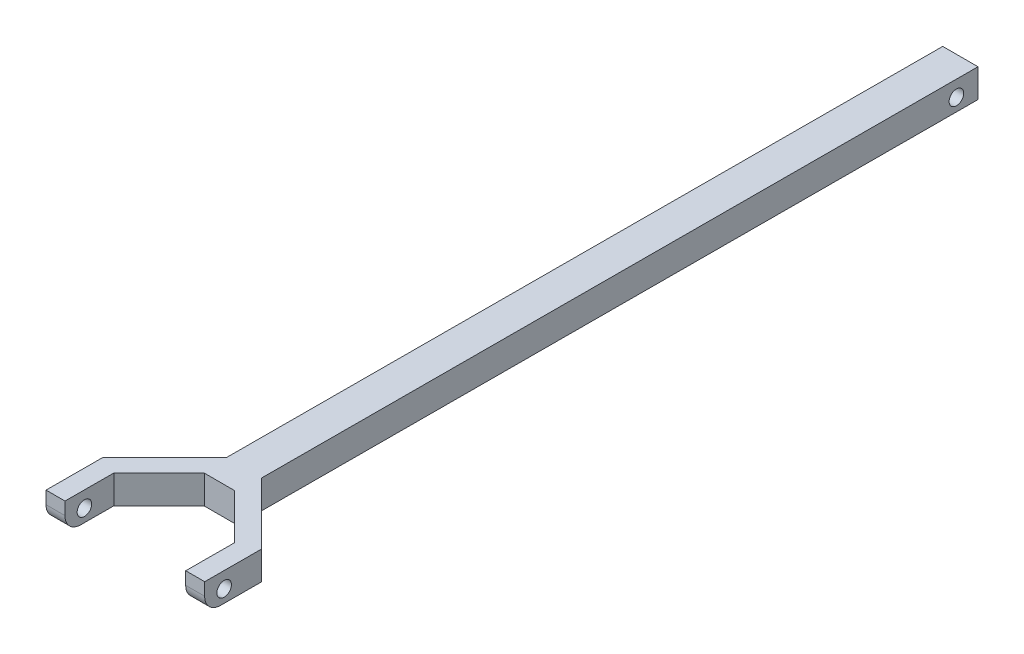
ISO-10303-21;
HEADER;
FILE_DESCRIPTION(('STEP AP214'),'2;1');
FILE_NAME('part.step','',(''),(''),'','','');
FILE_SCHEMA(('AUTOMOTIVE_DESIGN { 1 0 10303 214 1 1 1 1 }'));
ENDSEC;
DATA;
#1=APPLICATION_CONTEXT('core data for automotive mechanical design processes');
#2=APPLICATION_PROTOCOL_DEFINITION('international standard','automotive_design',2000,#1);
#3=PRODUCT_CONTEXT('',#1,'mechanical');
#4=PRODUCT('Part','Part','',(#3));
#5=PRODUCT_RELATED_PRODUCT_CATEGORY('part','',(#4));
#6=PRODUCT_DEFINITION_FORMATION('','',#4);
#7=PRODUCT_DEFINITION_CONTEXT('part definition',#1,'design');
#8=PRODUCT_DEFINITION('design','',#6,#7);
#9=PRODUCT_DEFINITION_SHAPE('','',#8);
#10=(LENGTH_UNIT() NAMED_UNIT(*) SI_UNIT(.MILLI.,.METRE.));
#11=(NAMED_UNIT(*) PLANE_ANGLE_UNIT() SI_UNIT($,.RADIAN.));
#12=(NAMED_UNIT(*) SI_UNIT($,.STERADIAN.) SOLID_ANGLE_UNIT());
#13=UNCERTAINTY_MEASURE_WITH_UNIT(LENGTH_MEASURE(1.E-05),#10,'distance_accuracy_value','');
#14=(GEOMETRIC_REPRESENTATION_CONTEXT(3) GLOBAL_UNCERTAINTY_ASSIGNED_CONTEXT((#13)) GLOBAL_UNIT_ASSIGNED_CONTEXT((#10,
#11,#12)) REPRESENTATION_CONTEXT('',''));
#15=CARTESIAN_POINT('',(0.,0.,0.));
#16=DIRECTION('',(0.,0.,1.));
#17=DIRECTION('',(1.,0.,0.));
#18=AXIS2_PLACEMENT_3D('',#15,#16,#17);
#19=CARTESIAN_POINT('',(3.33984376650697,11.540663664861,-74.8869134229491));
#20=DIRECTION('',(0.,0.999995866704138,-0.00287516515017934));
#21=DIRECTION('',(0.,-0.00287516515017934,-0.999995866704138));
#22=AXIS2_PLACEMENT_3D('',#19,#20,#21);
#23=PLANE('',#22);
#24=DIRECTION('',(0.,0.00287516515017934,0.999995866704138));
#25=VECTOR('',#24,1.);
#26=CARTESIAN_POINT('',(0.550981021856869,11.6019466932159,-53.5723899597585));
#27=LINE('',#26,#25);
#28=CARTESIAN_POINT('',(0.550981021856869,11.4629001913203,-101.933412688022));
#29=VERTEX_POINT('',#28);
#30=CARTESIAN_POINT('',(0.550981021856862,11.7888324279776,11.4273413760104));
#31=VERTEX_POINT('',#30);
#32=EDGE_CURVE('E408',#29,#31,#27,.T.);
#33=ORIENTED_EDGE('',*,*,#32,.T.);
#34=DIRECTION('',(-0.707106781186547,0.00203304877472305,0.707103858505015));
#35=VECTOR('',#34,1.);
#36=CARTESIAN_POINT('',(0.550981021856862,11.7888324279776,11.4273413760104));
#37=LINE('',#36,#35);
#38=CARTESIAN_POINT('',(-9.21015623349303,11.8168973096403,21.1884382856921));
#39=VERTEX_POINT('',#38);
#40=EDGE_CURVE('E389',#31,#39,#37,.T.);
#41=ORIENTED_EDGE('',*,*,#40,.T.);
#42=DIRECTION('',(0.,0.00287516515017934,0.999995866704138));
#43=VECTOR('',#42,1.);
#44=CARTESIAN_POINT('',(-9.21015623349303,11.8426900201157,30.1592634450462));
#45=LINE('',#44,#43);
#46=CARTESIAN_POINT('',(-9.21015623349303,11.8426900201157,30.1592634450462));
#47=VERTEX_POINT('',#46);
#48=EDGE_CURVE('E386',#39,#47,#45,.T.);
#49=ORIENTED_EDGE('',*,*,#48,.T.);
#50=DIRECTION('',(1.,0.,0.));
#51=VECTOR('',#50,1.);
#52=CARTESIAN_POINT('',(3.33984376650696,11.8426900201157,30.1592634450462));
#53=LINE('',#52,#51);
#54=CARTESIAN_POINT('',(-6.21015623349303,11.8426900201157,30.1592634450462));
#55=VERTEX_POINT('',#54);
#56=EDGE_CURVE('E381',#47,#55,#53,.T.);
#57=ORIENTED_EDGE('',*,*,#56,.T.);
#58=DIRECTION('',(0.,-0.00287516515017934,-0.999995866704138));
#59=VECTOR('',#58,1.);
#60=CARTESIAN_POINT('',(-6.21015623349303,11.8426900201157,30.1592634450462));
#61=LINE('',#60,#59);
#62=CARTESIAN_POINT('',(-6.21015623349303,11.8204701068381,22.4310738366098));
#63=VERTEX_POINT('',#62);
#64=EDGE_CURVE('E376',#55,#63,#61,.T.);
#65=ORIENTED_EDGE('',*,*,#64,.T.);
#66=DIRECTION('',(0.707106781186548,-0.00203304877472305,-0.707103858505014));
#67=VECTOR('',#66,1.);
#68=CARTESIAN_POINT('',(-6.21015623349303,11.8204701068381,22.4310738366098));
#69=LINE('',#68,#67);
#70=CARTESIAN_POINT('',(0.950733326051764,11.7998813667322,15.2702138751402));
#71=VERTEX_POINT('',#70);
#72=EDGE_CURVE('E371',#63,#71,#69,.T.);
#73=ORIENTED_EDGE('',*,*,#72,.T.);
#74=DIRECTION('',(1.,0.,0.));
#75=VECTOR('',#74,1.);
#76=CARTESIAN_POINT('',(5.72895420696216,11.7998813667322,15.2702138751402));
#77=LINE('',#76,#75);
#78=CARTESIAN_POINT('',(5.72895420696216,11.7998813667322,15.2702138751402));
#79=VERTEX_POINT('',#78);
#80=EDGE_CURVE('E366',#71,#79,#77,.T.);
#81=ORIENTED_EDGE('',*,*,#80,.T.);
#82=DIRECTION('',(0.707106781186548,0.00203304877472305,0.707103858505014));
#83=VECTOR('',#82,1.);
#84=CARTESIAN_POINT('',(12.889843766507,11.8204701068381,22.4310738366098));
#85=LINE('',#84,#83);
#86=CARTESIAN_POINT('',(12.889843766507,11.8204701068381,22.4310738366098));
#87=VERTEX_POINT('',#86);
#88=EDGE_CURVE('E361',#79,#87,#85,.T.);
#89=ORIENTED_EDGE('',*,*,#88,.T.);
#90=DIRECTION('',(0.,0.00287516515017934,0.999995866704138));
#91=VECTOR('',#90,1.);
#92=CARTESIAN_POINT('',(12.889843766507,11.8426900201157,30.1592634450462));
#93=LINE('',#92,#91);
#94=CARTESIAN_POINT('',(12.889843766507,11.8426900201157,30.1592634450462));
#95=VERTEX_POINT('',#94);
#96=EDGE_CURVE('E356',#87,#95,#93,.T.);
#97=ORIENTED_EDGE('',*,*,#96,.T.);
#98=DIRECTION('',(1.,0.,0.));
#99=VECTOR('',#98,1.);
#100=CARTESIAN_POINT('',(15.889843766507,11.8426900201157,30.1592634450462));
#101=LINE('',#100,#99);
#102=CARTESIAN_POINT('',(15.889843766507,11.8426900201157,30.1592634450462));
#103=VERTEX_POINT('',#102);
#104=EDGE_CURVE('E351',#95,#103,#101,.T.);
#105=ORIENTED_EDGE('',*,*,#104,.T.);
#106=DIRECTION('',(0.,-0.00287516515017934,-0.999995866704138));
#107=VECTOR('',#106,1.);
#108=CARTESIAN_POINT('',(15.889843766507,11.8426900201157,30.1592634450462));
#109=LINE('',#108,#107);
#110=CARTESIAN_POINT('',(15.889843766507,11.8168973096403,21.1884382856921));
#111=VERTEX_POINT('',#110);
#112=EDGE_CURVE('E346',#103,#111,#109,.T.);
#113=ORIENTED_EDGE('',*,*,#112,.T.);
#114=DIRECTION('',(-0.707106781186547,-0.00203304877472305,-0.707103858505015));
#115=VECTOR('',#114,1.);
#116=CARTESIAN_POINT('',(6.12870651115707,11.7888324279776,11.4273413760104));
#117=LINE('',#116,#115);
#118=CARTESIAN_POINT('',(6.12870651115707,11.7888324279776,11.4273413760104));
#119=VERTEX_POINT('',#118);
#120=EDGE_CURVE('E340',#111,#119,#117,.T.);
#121=ORIENTED_EDGE('',*,*,#120,.T.);
#122=DIRECTION('',(0.,-0.00287516515017934,-0.999995866704138));
#123=VECTOR('',#122,1.);
#124=CARTESIAN_POINT('',(6.12870651115697,11.4255230443679,-114.933358955176));
#125=LINE('',#124,#123);
#126=CARTESIAN_POINT('',(6.12870651115697,11.4629001913203,-101.933412688022));
#127=VERTEX_POINT('',#126);
#128=EDGE_CURVE('E394',#119,#127,#125,.T.);
#129=ORIENTED_EDGE('',*,*,#128,.T.);
#130=DIRECTION('',(1.,0.,0.));
#131=VECTOR('',#130,1.);
#132=CARTESIAN_POINT('',(4.73427513883197,11.4629001913203,-101.933412688022));
#133=LINE('',#132,#131);
#134=EDGE_CURVE('E399',#29,#127,#133,.T.);
#135=ORIENTED_EDGE('',*,*,#134,.F.);
#136=EDGE_LOOP('',(#33,#41,#49,#57,#65,#73,#81,#89,#97,#105,#113,#121,#129,#135));
#137=FACE_BOUND('',#136,.T.);
#138=ADVANCED_FACE('F44',(#137),#23,.T.);
#139=CARTESIAN_POINT('',(-6.21015623349303,8.97270726770621,-98.5188717565437));
#140=DIRECTION('',(1.,0.,0.));
#141=DIRECTION('',(0.,-0.00287516515017934,-0.999995866704138));
#142=AXIS2_PLACEMENT_3D('',#139,#140,#141);
#143=CYLINDRICAL_SURFACE('',#142,1.15);
#144=CARTESIAN_POINT('',(6.12870651115707,8.97270726770621,-98.5188717565437));
#145=DIRECTION('',(-1.,0.,0.));
#146=DIRECTION('',(0.,-0.00287516515017934,-0.999995866704138));
#147=AXIS2_PLACEMENT_3D('',#144,#145,#146);
#148=CIRCLE('',#147,1.15);
#149=CARTESIAN_POINT('',(6.12870651115707,8.96940082778351,-99.6688670032535));
#150=VERTEX_POINT('',#149);
#151=EDGE_CURVE('E412',#150,#150,#148,.T.);
#152=ORIENTED_EDGE('',*,*,#151,.F.);
#153=EDGE_LOOP('',(#152));
#154=FACE_BOUND('',#153,.T.);
#155=CARTESIAN_POINT('',(0.550981021856869,8.97270726770621,-98.5188717565437));
#156=DIRECTION('',(1.,0.,0.));
#157=DIRECTION('',(0.,-0.00287516515017934,-0.999995866704138));
#158=AXIS2_PLACEMENT_3D('',#155,#156,#157);
#159=CIRCLE('',#158,1.15);
#160=CARTESIAN_POINT('',(0.550981021856869,8.96940082778351,-99.6688670032535));
#161=VERTEX_POINT('',#160);
#162=EDGE_CURVE('E54',#161,#161,#159,.T.);
#163=ORIENTED_EDGE('',*,*,#162,.F.);
#164=EDGE_LOOP('',(#163));
#165=FACE_BOUND('',#164,.T.);
#166=ADVANCED_FACE('F439',(#154,#165),#143,.F.);
#167=CARTESIAN_POINT('',(6.12870651115697,8.96291052455993,-101.926224775146));
#168=DIRECTION('',(0.,-0.00287516515017934,-0.999995866704138));
#169=DIRECTION('',(-1.,0.,0.));
#170=AXIS2_PLACEMENT_3D('',#167,#168,#169);
#171=PLANE('',#170);
#172=DIRECTION('',(0.,0.999995866704138,-0.00287516515017934));
#173=VECTOR('',#172,1.);
#174=CARTESIAN_POINT('',(0.550981021856869,8.96291052455993,-101.926224775146));
#175=LINE('',#174,#173);
#176=CARTESIAN_POINT('',(0.550981021856869,6.96291879115166,-101.920474444846));
#177=VERTEX_POINT('',#176);
#178=EDGE_CURVE('E423',#177,#29,#175,.T.);
#179=ORIENTED_EDGE('',*,*,#178,.T.);
#180=ORIENTED_EDGE('',*,*,#134,.T.);
#181=DIRECTION('',(0.,-0.999995866704138,0.00287516515017934));
#182=VECTOR('',#181,1.);
#183=CARTESIAN_POINT('',(6.12870651115697,8.96291052455993,-101.926224775146));
#184=LINE('',#183,#182);
#185=CARTESIAN_POINT('',(6.12870651115697,6.96291879115166,-101.920474444846));
#186=VERTEX_POINT('',#185);
#187=EDGE_CURVE('E416',#127,#186,#184,.T.);
#188=ORIENTED_EDGE('',*,*,#187,.T.);
#189=DIRECTION('',(1.,0.,0.));
#190=VECTOR('',#189,1.);
#191=CARTESIAN_POINT('',(4.73427513883197,6.96291879115166,-101.920474444846));
#192=LINE('',#191,#190);
#193=EDGE_CURVE('E429',#177,#186,#192,.T.);
#194=ORIENTED_EDGE('',*,*,#193,.F.);
#195=EDGE_LOOP('',(#179,#180,#188,#194));
#196=FACE_BOUND('',#195,.T.);
#197=ADVANCED_FACE('F441',(#196),#171,.T.);
#198=CARTESIAN_POINT('',(0.550981021856869,8.9255333776076,-114.9261710423));
#199=DIRECTION('',(-1.,0.,0.));
#200=DIRECTION('',(0.,0.00287516515017934,0.999995866704138));
#201=AXIS2_PLACEMENT_3D('',#198,#199,#200);
#202=PLANE('',#201);
#203=ORIENTED_EDGE('',*,*,#162,.T.);
#204=EDGE_LOOP('',(#203));
#205=FACE_BOUND('',#204,.T.);
#206=DIRECTION('',(0.,-0.00287516515017934,-0.999995866704138));
#207=VECTOR('',#206,1.);
#208=CARTESIAN_POINT('',(0.550981021856869,6.98311195444586,-94.8971979458865));
#209=LINE('',#208,#207);
#210=CARTESIAN_POINT('',(0.550981021856862,7.28885102780899,11.4402796191862));
#211=VERTEX_POINT('',#210);
#212=EDGE_CURVE('E11',#211,#177,#209,.T.);
#213=ORIENTED_EDGE('',*,*,#212,.F.);
#214=DIRECTION('',(0.,-0.999995866704138,0.00287516515017934));
#215=VECTOR('',#214,1.);
#216=CARTESIAN_POINT('',(0.550981021856862,9.28884276121727,11.4345292888859));
#217=LINE('',#216,#215);
#218=EDGE_CURVE('E328',#31,#211,#217,.T.);
#219=ORIENTED_EDGE('',*,*,#218,.F.);
#220=ORIENTED_EDGE('',*,*,#32,.F.);
#221=ORIENTED_EDGE('',*,*,#178,.F.);
#222=EDGE_LOOP('',(#213,#219,#220,#221));
#223=FACE_BOUND('',#222,.T.);
#224=ADVANCED_FACE('F436',(#205,#223),#202,.T.);
#225=CARTESIAN_POINT('',(6.12870651115707,9.1019570264556,-53.5652020468831));
#226=DIRECTION('',(1.,0.,0.));
#227=DIRECTION('',(0.,-0.00287516515017934,-0.999995866704138));
#228=AXIS2_PLACEMENT_3D('',#225,#226,#227);
#229=PLANE('',#228);
#230=ORIENTED_EDGE('',*,*,#151,.T.);
#231=EDGE_LOOP('',(#230));
#232=FACE_BOUND('',#231,.T.);
#233=ORIENTED_EDGE('',*,*,#128,.F.);
#234=DIRECTION('',(0.,0.999995866704138,-0.00287516515017934));
#235=VECTOR('',#234,1.);
#236=CARTESIAN_POINT('',(6.12870651115707,9.28884276121727,11.4345292888859));
#237=LINE('',#236,#235);
#238=CARTESIAN_POINT('',(6.12870651115707,7.28885102780899,11.4402796191862));
#239=VERTEX_POINT('',#238);
#240=EDGE_CURVE('E221',#239,#119,#237,.T.);
#241=ORIENTED_EDGE('',*,*,#240,.F.);
#242=DIRECTION('',(0.,0.00287516515017934,0.999995866704138));
#243=VECTOR('',#242,1.);
#244=CARTESIAN_POINT('',(6.12870651115707,7.07132377886985,-64.2167134481781));
#245=LINE('',#244,#243);
#246=EDGE_CURVE('E68',#186,#239,#245,.T.);
#247=ORIENTED_EDGE('',*,*,#246,.F.);
#248=ORIENTED_EDGE('',*,*,#187,.F.);
#249=EDGE_LOOP('',(#233,#241,#247,#248));
#250=FACE_BOUND('',#249,.T.);
#251=ADVANCED_FACE('F455',(#232,#250),#229,.T.);
#252=CARTESIAN_POINT('',(3.33984376650697,7.04068226469239,-74.8739751797733));
#253=DIRECTION('',(0.,-0.999995866704138,0.00287516515017934));
#254=DIRECTION('',(0.,0.00287516515017934,0.999995866704138));
#255=AXIS2_PLACEMENT_3D('',#252,#253,#254);
#256=PLANE('',#255);
#257=ORIENTED_EDGE('',*,*,#246,.T.);
#258=DIRECTION('',(0.707106781186547,0.00203304877472305,0.707103858505015));
#259=VECTOR('',#258,1.);
#260=CARTESIAN_POINT('',(4.98340656197287,7.28555810130859,10.2949844038656));
#261=LINE('',#260,#259);
#262=CARTESIAN_POINT('',(15.889843766507,7.31691590947169,21.2013765288679));
#263=VERTEX_POINT('',#262);
#264=EDGE_CURVE('E167',#239,#263,#261,.T.);
#265=ORIENTED_EDGE('',*,*,#264,.T.);
#266=DIRECTION('',(0.,0.00287516515017934,0.999995866704138));
#267=VECTOR('',#266,1.);
#268=CARTESIAN_POINT('',(15.889843766507,7.28513830970059,10.1489789221088));
#269=LINE('',#268,#267);
#270=CARTESIAN_POINT('',(15.889843766507,7.33552070707167,27.6722120214617));
#271=VERTEX_POINT('',#270);
#272=EDGE_CURVE('E160',#263,#271,#269,.T.);
#273=ORIENTED_EDGE('',*,*,#272,.T.);
#274=DIRECTION('',(1.,0.,0.));
#275=VECTOR('',#274,1.);
#276=CARTESIAN_POINT('',(8.11484376650696,7.33552070707167,27.6722120214617));
#277=LINE('',#276,#275);
#278=CARTESIAN_POINT('',(12.889843766507,7.33552070707167,27.6722120214617));
#279=VERTEX_POINT('',#278);
#280=EDGE_CURVE('E164',#279,#271,#277,.T.);
#281=ORIENTED_EDGE('',*,*,#280,.F.);
#282=DIRECTION('',(0.,-0.00287516515017934,-0.999995866704138));
#283=VECTOR('',#282,1.);
#284=CARTESIAN_POINT('',(12.889843766507,7.27402835306177,6.28488411789061));
#285=LINE('',#284,#283);
#286=CARTESIAN_POINT('',(12.889843766507,7.32048870666949,22.4440120797856));
#287=VERTEX_POINT('',#286);
#288=EDGE_CURVE('E236',#279,#287,#285,.T.);
#289=ORIENTED_EDGE('',*,*,#288,.T.);
#290=DIRECTION('',(-0.707106781186548,-0.00203304877472305,-0.707103858505014));
#291=VECTOR('',#290,1.);
#292=CARTESIAN_POINT('',(-1.15769838957933,7.28009970301663,8.39652798634716));
#293=LINE('',#292,#291);
#294=CARTESIAN_POINT('',(5.72895420696216,7.2998999665636,15.283152118316));
#295=VERTEX_POINT('',#294);
#296=EDGE_CURVE('E257',#287,#295,#293,.T.);
#297=ORIENTED_EDGE('',*,*,#296,.T.);
#298=DIRECTION('',(-1.,0.,0.));
#299=VECTOR('',#298,1.);
#300=CARTESIAN_POINT('',(2.14528854627936,7.2998999665636,15.283152118316));
#301=LINE('',#300,#299);
#302=CARTESIAN_POINT('',(0.950733326051764,7.2998999665636,15.283152118316));
#303=VERTEX_POINT('',#302);
#304=EDGE_CURVE('E267',#295,#303,#301,.T.);
#305=ORIENTED_EDGE('',*,*,#304,.T.);
#306=DIRECTION('',(-0.707106781186548,0.00203304877472305,0.707103858505014));
#307=VECTOR('',#306,1.);
#308=CARTESIAN_POINT('',(4.25694114282087,7.29039407306958,11.976957967082));
#309=LINE('',#308,#307);
#310=CARTESIAN_POINT('',(-6.21015623349303,7.32048870666949,22.4440120797856));
#311=VERTEX_POINT('',#310);
#312=EDGE_CURVE('E279',#303,#311,#309,.T.);
#313=ORIENTED_EDGE('',*,*,#312,.T.);
#314=DIRECTION('',(0.,0.00287516515017934,0.999995866704138));
#315=VECTOR('',#314,1.);
#316=CARTESIAN_POINT('',(-6.21015623349303,7.28513830970059,10.1489789221088));
#317=LINE('',#316,#315);
#318=CARTESIAN_POINT('',(-6.21015623349303,7.33552070707167,27.6722120214617));
#319=VERTEX_POINT('',#318);
#320=EDGE_CURVE('E190',#311,#319,#317,.T.);
#321=ORIENTED_EDGE('',*,*,#320,.T.);
#322=DIRECTION('',(1.,0.,0.));
#323=VECTOR('',#322,1.);
#324=CARTESIAN_POINT('',(8.11484376650696,7.33552070707167,27.6722120214617));
#325=LINE('',#324,#323);
#326=CARTESIAN_POINT('',(-9.21015623349303,7.33552070707167,27.6722120214617));
#327=VERTEX_POINT('',#326);
#328=EDGE_CURVE('E186',#327,#319,#325,.T.);
#329=ORIENTED_EDGE('',*,*,#328,.F.);
#330=DIRECTION('',(0.,-0.00287516515017934,-0.999995866704138));
#331=VECTOR('',#330,1.);
#332=CARTESIAN_POINT('',(-9.21015623349303,7.27224195446287,5.66356634243181));
#333=LINE('',#332,#331);
#334=CARTESIAN_POINT('',(-9.21015623349303,7.31691590947169,21.2013765288679));
#335=VERTEX_POINT('',#334);
#336=EDGE_CURVE('E307',#327,#335,#333,.T.);
#337=ORIENTED_EDGE('',*,*,#336,.T.);
#338=DIRECTION('',(0.707106781186547,-0.00203304877472305,-0.707103858505015));
#339=VECTOR('',#338,1.);
#340=CARTESIAN_POINT('',(6.57684959871596,7.27152566047724,5.41443594902476));
#341=LINE('',#340,#339);
#342=EDGE_CURVE('E325',#335,#211,#341,.T.);
#343=ORIENTED_EDGE('',*,*,#342,.T.);
#344=ORIENTED_EDGE('',*,*,#212,.T.);
#345=ORIENTED_EDGE('',*,*,#193,.T.);
#346=EDGE_LOOP('',(#257,#265,#273,#281,#289,#297,#305,#313,#321,#329,#337,#343,#344,#345));
#347=FACE_BOUND('',#346,.T.);
#348=ADVANCED_FACE('F46',(#347),#256,.T.);
#349=CARTESIAN_POINT('',(0.550981021856862,9.28884276121727,11.4345292888859));
#350=DIRECTION('',(-0.707106781186548,-0.00203304877472305,-0.707103858505014));
#351=DIRECTION('',(-0.707106781186547,0.00203304877472305,0.707103858505015));
#352=AXIS2_PLACEMENT_3D('',#349,#350,#351);
#353=PLANE('',#352);
#354=DIRECTION('',(0.,0.999995866704138,-0.00287516515017934));
#355=VECTOR('',#354,1.);
#356=CARTESIAN_POINT('',(-9.21015623349303,9.31690764287996,21.1956261985676));
#357=LINE('',#356,#355);
#358=EDGE_CURVE('E334',#335,#39,#357,.T.);
#359=ORIENTED_EDGE('',*,*,#358,.T.);
#360=ORIENTED_EDGE('',*,*,#40,.F.);
#361=ORIENTED_EDGE('',*,*,#218,.T.);
#362=ORIENTED_EDGE('',*,*,#342,.F.);
#363=EDGE_LOOP('',(#359,#360,#361,#362));
#364=FACE_BOUND('',#363,.T.);
#365=ADVANCED_FACE('F472',(#364),#353,.T.);
#366=CARTESIAN_POINT('',(-9.21015623349303,9.31690764287996,21.1956261985676));
#367=DIRECTION('',(-1.,0.,0.));
#368=DIRECTION('',(0.,0.00287516515017934,0.999995866704138));
#369=AXIS2_PLACEMENT_3D('',#366,#367,#368);
#370=PLANE('',#369);
#371=CARTESIAN_POINT('',(-9.21015623349303,9.33383960989393,27.0846434009645));
#372=DIRECTION('',(1.,0.,0.));
#373=DIRECTION('',(0.,-0.00287516515017934,-0.999995866704138));
#374=AXIS2_PLACEMENT_3D('',#371,#372,#373);
#375=CIRCLE('',#374,1.15);
#376=CARTESIAN_POINT('',(-9.21015623349303,9.33053316997122,25.9346481542547));
#377=VERTEX_POINT('',#376);
#378=EDGE_CURVE('E321',#377,#377,#375,.T.);
#379=ORIENTED_EDGE('',*,*,#378,.T.);
#380=EDGE_LOOP('',(#379));
#381=FACE_BOUND('',#380,.T.);
#382=CARTESIAN_POINT('',(-9.21015623349303,9.83551037383202,27.6650241085863));
#383=DIRECTION('',(1.,0.,0.));
#384=DIRECTION('',(0.,0.00287516515017934,0.999995866704138));
#385=AXIS2_PLACEMENT_3D('',#382,#383,#384);
#386=CIRCLE('',#385,2.5);
#387=CARTESIAN_POINT('',(-9.21015623349303,9.84269828670746,30.1650137753466));
#388=VERTEX_POINT('',#387);
#389=EDGE_CURVE('E317',#388,#327,#386,.T.);
#390=ORIENTED_EDGE('',*,*,#389,.F.);
#391=DIRECTION('',(0.,0.999995866704138,-0.00287516515017934));
#392=VECTOR('',#391,1.);
#393=CARTESIAN_POINT('',(-9.21015623349303,9.34270035335539,30.1664513579217));
#394=LINE('',#393,#392);
#395=EDGE_CURVE('E311',#388,#47,#394,.T.);
#396=ORIENTED_EDGE('',*,*,#395,.T.);
#397=ORIENTED_EDGE('',*,*,#48,.F.);
#398=ORIENTED_EDGE('',*,*,#358,.F.);
#399=ORIENTED_EDGE('',*,*,#336,.F.);
#400=EDGE_LOOP('',(#390,#396,#397,#398,#399));
#401=FACE_BOUND('',#400,.T.);
#402=ADVANCED_FACE('F477',(#381,#401),#370,.T.);
#403=CARTESIAN_POINT('',(12.889843766507,9.34270035335539,30.1664513579217));
#404=DIRECTION('',(0.,0.00287516515017934,0.999995866704138));
#405=DIRECTION('',(1.,0.,0.));
#406=AXIS2_PLACEMENT_3D('',#403,#404,#405);
#407=PLANE('',#406);
#408=DIRECTION('',(-1.,0.,0.));
#409=VECTOR('',#408,1.);
#410=CARTESIAN_POINT('',(8.11484376650696,9.84269828670746,30.1650137753466));
#411=LINE('',#410,#409);
#412=CARTESIAN_POINT('',(-6.21015623349303,9.84269828670746,30.1650137753466));
#413=VERTEX_POINT('',#412);
#414=EDGE_CURVE('E303',#413,#388,#411,.T.);
#415=ORIENTED_EDGE('',*,*,#414,.F.);
#416=DIRECTION('',(0.,0.999995866704138,-0.00287516515017934));
#417=VECTOR('',#416,1.);
#418=CARTESIAN_POINT('',(-6.21015623349303,9.34270035335539,30.1664513579217));
#419=LINE('',#418,#417);
#420=EDGE_CURVE('E297',#413,#55,#419,.T.);
#421=ORIENTED_EDGE('',*,*,#420,.T.);
#422=ORIENTED_EDGE('',*,*,#56,.F.);
#423=ORIENTED_EDGE('',*,*,#395,.F.);
#424=EDGE_LOOP('',(#415,#421,#422,#423));
#425=FACE_BOUND('',#424,.T.);
#426=ADVANCED_FACE('F483',(#425),#407,.T.);
#427=CARTESIAN_POINT('',(-6.21015623349303,9.32048044007776,22.4382617494852));
#428=DIRECTION('',(0.707106781186547,0.00203304877472305,0.707103858505015));
#429=DIRECTION('',(0.707106781186548,-0.00203304877472305,-0.707103858505014));
#430=AXIS2_PLACEMENT_3D('',#427,#428,#429);
#431=PLANE('',#430);
#432=DIRECTION('',(0.,0.999995866704138,-0.00287516515017934));
#433=VECTOR('',#432,1.);
#434=CARTESIAN_POINT('',(0.950733326051764,9.29989169997188,15.2774017880156));
#435=LINE('',#434,#433);
#436=EDGE_CURVE('E291',#303,#71,#435,.T.);
#437=ORIENTED_EDGE('',*,*,#436,.T.);
#438=ORIENTED_EDGE('',*,*,#72,.F.);
#439=DIRECTION('',(0.,0.999995866704138,-0.00287516515017934));
#440=VECTOR('',#439,1.);
#441=CARTESIAN_POINT('',(-6.21015623349303,9.32048044007776,22.4382617494852));
#442=LINE('',#441,#440);
#443=EDGE_CURVE('E285',#311,#63,#442,.T.);
#444=ORIENTED_EDGE('',*,*,#443,.F.);
#445=ORIENTED_EDGE('',*,*,#312,.F.);
#446=EDGE_LOOP('',(#437,#438,#444,#445));
#447=FACE_BOUND('',#446,.T.);
#448=ADVANCED_FACE('F490',(#447),#431,.T.);
#449=CARTESIAN_POINT('',(0.950733326051764,9.29989169997188,15.2774017880156));
#450=DIRECTION('',(0.,0.00287516515017934,0.999995866704138));
#451=DIRECTION('',(1.,0.,0.));
#452=AXIS2_PLACEMENT_3D('',#449,#450,#451);
#453=PLANE('',#452);
#454=DIRECTION('',(0.,0.999995866704138,-0.00287516515017934));
#455=VECTOR('',#454,1.);
#456=CARTESIAN_POINT('',(5.72895420696216,9.29989169997188,15.2774017880156));
#457=LINE('',#456,#455);
#458=EDGE_CURVE('E273',#295,#79,#457,.T.);
#459=ORIENTED_EDGE('',*,*,#458,.T.);
#460=ORIENTED_EDGE('',*,*,#80,.F.);
#461=ORIENTED_EDGE('',*,*,#436,.F.);
#462=ORIENTED_EDGE('',*,*,#304,.F.);
#463=EDGE_LOOP('',(#459,#460,#461,#462));
#464=FACE_BOUND('',#463,.T.);
#465=ADVANCED_FACE('F498',(#464),#453,.T.);
#466=CARTESIAN_POINT('',(5.72895420696216,9.29989169997188,15.2774017880156));
#467=DIRECTION('',(-0.707106781186547,0.00203304877472305,0.707103858505015));
#468=DIRECTION('',(0.707106781186548,0.00203304877472305,0.707103858505014));
#469=AXIS2_PLACEMENT_3D('',#466,#467,#468);
#470=PLANE('',#469);
#471=DIRECTION('',(0.,0.999995866704138,-0.00287516515017934));
#472=VECTOR('',#471,1.);
#473=CARTESIAN_POINT('',(12.889843766507,9.32048044007776,22.4382617494852));
#474=LINE('',#473,#472);
#475=EDGE_CURVE('E261',#287,#87,#474,.T.);
#476=ORIENTED_EDGE('',*,*,#475,.T.);
#477=ORIENTED_EDGE('',*,*,#88,.F.);
#478=ORIENTED_EDGE('',*,*,#458,.F.);
#479=ORIENTED_EDGE('',*,*,#296,.F.);
#480=EDGE_LOOP('',(#476,#477,#478,#479));
#481=FACE_BOUND('',#480,.T.);
#482=ADVANCED_FACE('F505',(#481),#470,.T.);
#483=CARTESIAN_POINT('',(12.889843766507,9.32048044007776,22.4382617494852));
#484=DIRECTION('',(-1.,0.,0.));
#485=DIRECTION('',(0.,0.00287516515017934,0.999995866704138));
#486=AXIS2_PLACEMENT_3D('',#483,#484,#485);
#487=PLANE('',#486);
#488=CARTESIAN_POINT('',(12.889843766507,9.33383960989393,27.0846434009645));
#489=DIRECTION('',(1.,0.,0.));
#490=DIRECTION('',(0.,-0.00287516515017934,-0.999995866704138));
#491=AXIS2_PLACEMENT_3D('',#488,#489,#490);
#492=CIRCLE('',#491,1.15);
#493=CARTESIAN_POINT('',(12.889843766507,9.33053316997122,25.9346481542547));
#494=VERTEX_POINT('',#493);
#495=EDGE_CURVE('E251',#494,#494,#492,.T.);
#496=ORIENTED_EDGE('',*,*,#495,.T.);
#497=EDGE_LOOP('',(#496));
#498=FACE_BOUND('',#497,.T.);
#499=CARTESIAN_POINT('',(12.889843766507,9.83551037383202,27.6650241085862));
#500=DIRECTION('',(1.,0.,0.));
#501=DIRECTION('',(0.,-0.705070809730292,0.709136907279738));
#502=AXIS2_PLACEMENT_3D('',#499,#500,#501);
#503=CIRCLE('',#502,2.5);
#504=CARTESIAN_POINT('',(12.889843766507,9.84269828670746,30.1650137753466));
#505=VERTEX_POINT('',#504);
#506=EDGE_CURVE('E184',#505,#279,#503,.T.);
#507=ORIENTED_EDGE('',*,*,#506,.F.);
#508=DIRECTION('',(0.,0.999995866704138,-0.00287516515017934));
#509=VECTOR('',#508,1.);
#510=CARTESIAN_POINT('',(12.889843766507,9.34270035335539,30.1664513579217));
#511=LINE('',#510,#509);
#512=EDGE_CURVE('E241',#505,#95,#511,.T.);
#513=ORIENTED_EDGE('',*,*,#512,.T.);
#514=ORIENTED_EDGE('',*,*,#96,.F.);
#515=ORIENTED_EDGE('',*,*,#475,.F.);
#516=ORIENTED_EDGE('',*,*,#288,.F.);
#517=EDGE_LOOP('',(#507,#513,#514,#515,#516));
#518=FACE_BOUND('',#517,.T.);
#519=ADVANCED_FACE('F512',(#498,#518),#487,.T.);
#520=DIRECTION('',(-1.,0.,0.));
#521=VECTOR('',#520,1.);
#522=CARTESIAN_POINT('',(8.11484376650696,9.84269828670746,30.1650137753466));
#523=LINE('',#522,#521);
#524=CARTESIAN_POINT('',(15.889843766507,9.84269828670746,30.1650137753466));
#525=VERTEX_POINT('',#524);
#526=EDGE_CURVE('E231',#525,#505,#523,.T.);
#527=ORIENTED_EDGE('',*,*,#526,.F.);
#528=DIRECTION('',(0.,0.999995866704138,-0.00287516515017934));
#529=VECTOR('',#528,1.);
#530=CARTESIAN_POINT('',(15.889843766507,9.34270035335539,30.1664513579217));
#531=LINE('',#530,#529);
#532=EDGE_CURVE('E178',#525,#103,#531,.T.);
#533=ORIENTED_EDGE('',*,*,#532,.T.);
#534=ORIENTED_EDGE('',*,*,#104,.F.);
#535=ORIENTED_EDGE('',*,*,#512,.F.);
#536=EDGE_LOOP('',(#527,#533,#534,#535));
#537=FACE_BOUND('',#536,.T.);
#538=ADVANCED_FACE('F493',(#537),#407,.T.);
#539=CARTESIAN_POINT('',(15.889843766507,9.31690764287996,21.1956261985676));
#540=DIRECTION('',(0.707106781186548,-0.00203304877472305,-0.707103858505014));
#541=DIRECTION('',(-0.707106781186547,-0.00203304877472305,-0.707103858505015));
#542=AXIS2_PLACEMENT_3D('',#539,#540,#541);
#543=PLANE('',#542);
#544=ORIENTED_EDGE('',*,*,#240,.T.);
#545=ORIENTED_EDGE('',*,*,#120,.F.);
#546=DIRECTION('',(0.,0.999995866704138,-0.00287516515017934));
#547=VECTOR('',#546,1.);
#548=CARTESIAN_POINT('',(15.889843766507,9.31690764287996,21.1956261985676));
#549=LINE('',#548,#547);
#550=EDGE_CURVE('E216',#263,#111,#549,.T.);
#551=ORIENTED_EDGE('',*,*,#550,.F.);
#552=ORIENTED_EDGE('',*,*,#264,.F.);
#553=EDGE_LOOP('',(#544,#545,#551,#552));
#554=FACE_BOUND('',#553,.T.);
#555=ADVANCED_FACE('F525',(#554),#543,.T.);
#556=CARTESIAN_POINT('',(-6.21015623349303,9.33383960989393,27.0846434009645));
#557=DIRECTION('',(1.,0.,0.));
#558=DIRECTION('',(0.,-0.00287516515017934,-0.999995866704138));
#559=AXIS2_PLACEMENT_3D('',#556,#557,#558);
#560=CYLINDRICAL_SURFACE('',#559,1.15);
#561=CARTESIAN_POINT('',(15.889843766507,9.33383960989393,27.0846434009645));
#562=DIRECTION('',(-1.,0.,0.));
#563=DIRECTION('',(0.,-0.00287516515017934,-0.999995866704138));
#564=AXIS2_PLACEMENT_3D('',#561,#562,#563);
#565=CIRCLE('',#564,1.15);
#566=CARTESIAN_POINT('',(15.889843766507,9.33053316997122,25.9346481542547));
#567=VERTEX_POINT('',#566);
#568=EDGE_CURVE('E210',#567,#567,#565,.T.);
#569=ORIENTED_EDGE('',*,*,#568,.F.);
#570=EDGE_LOOP('',(#569));
#571=FACE_BOUND('',#570,.T.);
#572=ORIENTED_EDGE('',*,*,#495,.F.);
#573=EDGE_LOOP('',(#572));
#574=FACE_BOUND('',#573,.T.);
#575=ADVANCED_FACE('F531',(#571,#574),#560,.F.);
#576=CARTESIAN_POINT('',(-6.21015623349303,9.33383960989393,27.0846434009645));
#577=DIRECTION('',(-1.,0.,0.));
#578=DIRECTION('',(0.,-0.00287516515017934,-0.999995866704138));
#579=AXIS2_PLACEMENT_3D('',#576,#577,#578);
#580=CIRCLE('',#579,1.15);
#581=CARTESIAN_POINT('',(-6.21015623349303,9.33053316997122,25.9346481542547));
#582=VERTEX_POINT('',#581);
#583=EDGE_CURVE('E206',#582,#582,#580,.T.);
#584=ORIENTED_EDGE('',*,*,#583,.F.);
#585=EDGE_LOOP('',(#584));
#586=FACE_BOUND('',#585,.T.);
#587=ORIENTED_EDGE('',*,*,#378,.F.);
#588=EDGE_LOOP('',(#587));
#589=FACE_BOUND('',#588,.T.);
#590=ADVANCED_FACE('F538',(#586,#589),#560,.F.);
#591=CARTESIAN_POINT('',(-6.21015623349303,9.34270035335539,30.1664513579217));
#592=DIRECTION('',(1.,0.,0.));
#593=DIRECTION('',(0.,-0.00287516515017934,-0.999995866704138));
#594=AXIS2_PLACEMENT_3D('',#591,#592,#593);
#595=PLANE('',#594);
#596=ORIENTED_EDGE('',*,*,#583,.T.);
#597=EDGE_LOOP('',(#596));
#598=FACE_BOUND('',#597,.T.);
#599=CARTESIAN_POINT('',(-6.21015623349303,9.83551037383202,27.6650241085863));
#600=DIRECTION('',(-1.,0.,0.));
#601=DIRECTION('',(0.,-0.00287516515017934,-0.999995866704138));
#602=AXIS2_PLACEMENT_3D('',#599,#600,#601);
#603=CIRCLE('',#602,2.5);
#604=EDGE_CURVE('E200',#319,#413,#603,.T.);
#605=ORIENTED_EDGE('',*,*,#604,.F.);
#606=ORIENTED_EDGE('',*,*,#320,.F.);
#607=ORIENTED_EDGE('',*,*,#443,.T.);
#608=ORIENTED_EDGE('',*,*,#64,.F.);
#609=ORIENTED_EDGE('',*,*,#420,.F.);
#610=EDGE_LOOP('',(#605,#606,#607,#608,#609));
#611=FACE_BOUND('',#610,.T.);
#612=ADVANCED_FACE('F545',(#598,#611),#595,.T.);
#613=CARTESIAN_POINT('',(8.11484376650696,9.83551037383202,27.6650241085863));
#614=DIRECTION('',(-1.,0.,0.));
#615=DIRECTION('',(0.,-0.705070809730292,0.709136907279738));
#616=AXIS2_PLACEMENT_3D('',#613,#614,#615);
#617=CYLINDRICAL_SURFACE('',#616,2.5);
#618=ORIENTED_EDGE('',*,*,#389,.T.);
#619=ORIENTED_EDGE('',*,*,#328,.T.);
#620=ORIENTED_EDGE('',*,*,#604,.T.);
#621=ORIENTED_EDGE('',*,*,#414,.T.);
#622=EDGE_LOOP('',(#618,#619,#620,#621));
#623=FACE_BOUND('',#622,.T.);
#624=ADVANCED_FACE('F551',(#623),#617,.T.);
#625=CARTESIAN_POINT('',(15.889843766507,9.34270035335539,30.1664513579217));
#626=DIRECTION('',(1.,0.,0.));
#627=DIRECTION('',(0.,-0.00287516515017934,-0.999995866704138));
#628=AXIS2_PLACEMENT_3D('',#625,#626,#627);
#629=PLANE('',#628);
#630=ORIENTED_EDGE('',*,*,#568,.T.);
#631=EDGE_LOOP('',(#630));
#632=FACE_BOUND('',#631,.T.);
#633=CARTESIAN_POINT('',(15.889843766507,9.83551037383202,27.6650241085862));
#634=DIRECTION('',(-1.,0.,0.));
#635=DIRECTION('',(0.,-0.705070809730292,0.709136907279738));
#636=AXIS2_PLACEMENT_3D('',#633,#634,#635);
#637=CIRCLE('',#636,2.5);
#638=EDGE_CURVE('E171',#271,#525,#637,.T.);
#639=ORIENTED_EDGE('',*,*,#638,.F.);
#640=ORIENTED_EDGE('',*,*,#272,.F.);
#641=ORIENTED_EDGE('',*,*,#550,.T.);
#642=ORIENTED_EDGE('',*,*,#112,.F.);
#643=ORIENTED_EDGE('',*,*,#532,.F.);
#644=EDGE_LOOP('',(#639,#640,#641,#642,#643));
#645=FACE_BOUND('',#644,.T.);
#646=ADVANCED_FACE('F175',(#632,#645),#629,.T.);
#647=ORIENTED_EDGE('',*,*,#638,.T.);
#648=ORIENTED_EDGE('',*,*,#526,.T.);
#649=ORIENTED_EDGE('',*,*,#506,.T.);
#650=ORIENTED_EDGE('',*,*,#280,.T.);
#651=EDGE_LOOP('',(#647,#648,#649,#650));
#652=FACE_BOUND('',#651,.T.);
#653=ADVANCED_FACE('F183',(#652),#617,.T.);
#654=CLOSED_SHELL('',(#138,#166,#197,#224,#251,#348,#365,#402,#426,#448,#465,#482,#519,#538,
#555,#575,#590,#612,#624,#646,#653));
#655=MANIFOLD_SOLID_BREP('B2',#654);
#656=ADVANCED_BREP_SHAPE_REPRESENTATION('',(#18,#655),#14);
#657=SHAPE_DEFINITION_REPRESENTATION(#9,#656);
ENDSEC;
END-ISO-10303-21;
